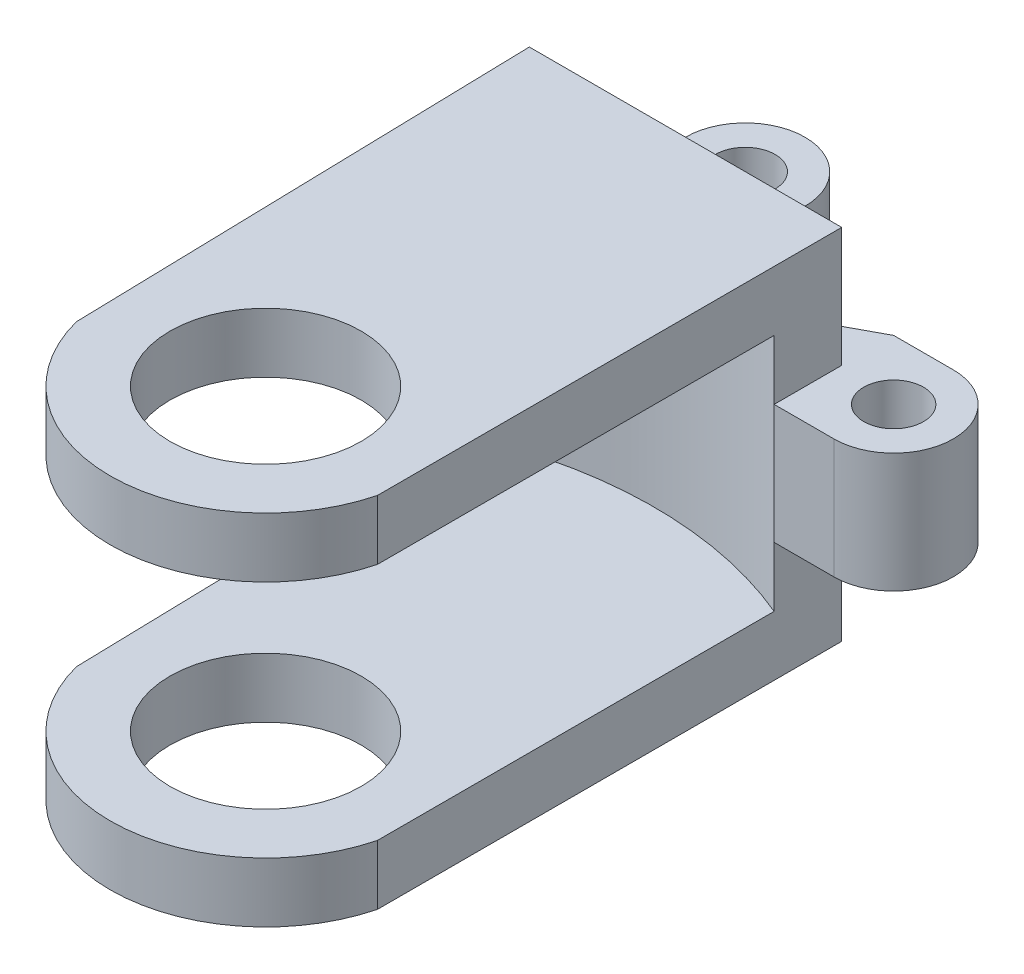
ISO-10303-21;
HEADER;
FILE_DESCRIPTION(('STEP AP214'),'2;1');
FILE_NAME('part.step','',(''),(''),'','','');
FILE_SCHEMA(('AUTOMOTIVE_DESIGN { 1 0 10303 214 1 1 1 1 }'));
ENDSEC;
DATA;
#1=APPLICATION_CONTEXT('core data for automotive mechanical design processes');
#2=APPLICATION_PROTOCOL_DEFINITION('international standard','automotive_design',2000,#1);
#3=PRODUCT_CONTEXT('',#1,'mechanical');
#4=PRODUCT('Part','Part','',(#3));
#5=PRODUCT_RELATED_PRODUCT_CATEGORY('part','',(#4));
#6=PRODUCT_DEFINITION_FORMATION('','',#4);
#7=PRODUCT_DEFINITION_CONTEXT('part definition',#1,'design');
#8=PRODUCT_DEFINITION('design','',#6,#7);
#9=PRODUCT_DEFINITION_SHAPE('','',#8);
#10=(LENGTH_UNIT() NAMED_UNIT(*) SI_UNIT(.MILLI.,.METRE.));
#11=(NAMED_UNIT(*) PLANE_ANGLE_UNIT() SI_UNIT($,.RADIAN.));
#12=(NAMED_UNIT(*) SI_UNIT($,.STERADIAN.) SOLID_ANGLE_UNIT());
#13=UNCERTAINTY_MEASURE_WITH_UNIT(LENGTH_MEASURE(1.E-05),#10,'distance_accuracy_value','');
#14=(GEOMETRIC_REPRESENTATION_CONTEXT(3) GLOBAL_UNCERTAINTY_ASSIGNED_CONTEXT((#13)) GLOBAL_UNIT_ASSIGNED_CONTEXT((#10,
#11,#12)) REPRESENTATION_CONTEXT('',''));
#15=CARTESIAN_POINT('',(0.,0.,0.));
#16=DIRECTION('',(0.,0.,1.));
#17=DIRECTION('',(1.,0.,0.));
#18=AXIS2_PLACEMENT_3D('',#15,#16,#17);
#19=CARTESIAN_POINT('',(0.,38.1,-45.2340686819217));
#20=DIRECTION('',(0.,0.,-1.));
#21=DIRECTION('',(-1.,0.,0.));
#22=AXIS2_PLACEMENT_3D('',#19,#20,#21);
#23=PLANE('',#22);
#24=DIRECTION('',(-1.,0.,0.));
#25=VECTOR('',#24,1.);
#26=CARTESIAN_POINT('',(15.9911865919839,12.7,-45.2340686819217));
#27=LINE('',#26,#25);
#28=CARTESIAN_POINT('',(15.9911865919839,12.7,-45.2340686819217));
#29=VERTEX_POINT('',#28);
#30=CARTESIAN_POINT('',(5.7409034787379,12.7,-45.2340686819217));
#31=VERTEX_POINT('',#30);
#32=EDGE_CURVE('E93',#29,#31,#27,.T.);
#33=ORIENTED_EDGE('',*,*,#32,.F.);
#34=DIRECTION('',(0.,1.,0.));
#35=VECTOR('',#34,1.);
#36=CARTESIAN_POINT('',(15.9911865919839,-50.229493101425,-45.2340686819217));
#37=LINE('',#36,#35);
#38=CARTESIAN_POINT('',(15.9911865919839,0.,-45.2340686819217));
#39=VERTEX_POINT('',#38);
#40=EDGE_CURVE('E353',#39,#29,#37,.T.);
#41=ORIENTED_EDGE('',*,*,#40,.F.);
#42=DIRECTION('',(1.,0.,0.));
#43=VECTOR('',#42,1.);
#44=CARTESIAN_POINT('',(0.,0.,-45.2340686819217));
#45=LINE('',#44,#43);
#46=CARTESIAN_POINT('',(-17.2093796345081,0.,-45.2340686819217));
#47=VERTEX_POINT('',#46);
#48=EDGE_CURVE('E408',#47,#39,#45,.T.);
#49=ORIENTED_EDGE('',*,*,#48,.F.);
#50=DIRECTION('',(0.,1.,0.));
#51=VECTOR('',#50,1.);
#52=CARTESIAN_POINT('',(-17.2093796345081,-50.229493101425,-45.2340686819217));
#53=LINE('',#52,#51);
#54=CARTESIAN_POINT('',(-17.2093796345081,38.1,-45.2340686819217));
#55=VERTEX_POINT('',#54);
#56=EDGE_CURVE('E361',#47,#55,#53,.T.);
#57=ORIENTED_EDGE('',*,*,#56,.T.);
#58=DIRECTION('',(1.,0.,0.));
#59=VECTOR('',#58,1.);
#60=CARTESIAN_POINT('',(0.,38.1,-45.2340686819217));
#61=LINE('',#60,#59);
#62=CARTESIAN_POINT('',(15.9911865919839,38.1,-45.2340686819217));
#63=VERTEX_POINT('',#62);
#64=EDGE_CURVE('E398',#55,#63,#61,.T.);
#65=ORIENTED_EDGE('',*,*,#64,.T.);
#66=CARTESIAN_POINT('',(15.9911865919839,25.4,-45.2340686819217));
#67=VERTEX_POINT('',#66);
#68=EDGE_CURVE('E357',#67,#63,#37,.T.);
#69=ORIENTED_EDGE('',*,*,#68,.F.);
#70=DIRECTION('',(-1.,0.,0.));
#71=VECTOR('',#70,1.);
#72=CARTESIAN_POINT('',(15.9911865919839,25.4,-45.2340686819217));
#73=LINE('',#72,#71);
#74=CARTESIAN_POINT('',(5.7409034787379,25.4,-45.2340686819217));
#75=VERTEX_POINT('',#74);
#76=EDGE_CURVE('E309',#67,#75,#73,.T.);
#77=ORIENTED_EDGE('',*,*,#76,.T.);
#78=DIRECTION('',(0.,-1.,0.));
#79=VECTOR('',#78,1.);
#80=CARTESIAN_POINT('',(5.7409034787379,31.75,-45.2340686819217));
#81=LINE('',#80,#79);
#82=CARTESIAN_POINT('',(5.7409034787379,31.75,-45.2340686819217));
#83=VERTEX_POINT('',#82);
#84=EDGE_CURVE('E339',#83,#75,#81,.T.);
#85=ORIENTED_EDGE('',*,*,#84,.F.);
#86=DIRECTION('',(1.,0.,0.));
#87=VECTOR('',#86,1.);
#88=CARTESIAN_POINT('',(0.,31.75,-45.2340686819217));
#89=LINE('',#88,#87);
#90=CARTESIAN_POINT('',(-6.9590965212621,31.75,-45.2340686819217));
#91=VERTEX_POINT('',#90);
#92=EDGE_CURVE('E321',#91,#83,#89,.T.);
#93=ORIENTED_EDGE('',*,*,#92,.F.);
#94=DIRECTION('',(0.,-1.,0.));
#95=VECTOR('',#94,1.);
#96=CARTESIAN_POINT('',(-6.9590965212621,31.75,-45.2340686819217));
#97=LINE('',#96,#95);
#98=CARTESIAN_POINT('',(-6.9590965212621,25.4,-45.2340686819217));
#99=VERTEX_POINT('',#98);
#100=EDGE_CURVE('E342',#91,#99,#97,.T.);
#101=ORIENTED_EDGE('',*,*,#100,.T.);
#102=DIRECTION('',(1.,0.,0.));
#103=VECTOR('',#102,1.);
#104=CARTESIAN_POINT('',(0.,25.4,-45.2340686819217));
#105=LINE('',#104,#103);
#106=EDGE_CURVE('E333',#99,#75,#105,.T.);
#107=ORIENTED_EDGE('',*,*,#106,.T.);
#108=DIRECTION('',(0.,-1.,0.));
#109=VECTOR('',#108,1.);
#110=CARTESIAN_POINT('',(5.7409034787379,25.4,-45.2340686819217));
#111=LINE('',#110,#109);
#112=EDGE_CURVE('E293',#75,#31,#111,.T.);
#113=ORIENTED_EDGE('',*,*,#112,.T.);
#114=DIRECTION('',(1.,0.,0.));
#115=VECTOR('',#114,1.);
#116=CARTESIAN_POINT('',(0.,12.7,-45.2340686819217));
#117=LINE('',#116,#115);
#118=CARTESIAN_POINT('',(-6.9590965212621,12.7,-45.2340686819217));
#119=VERTEX_POINT('',#118);
#120=EDGE_CURVE('E277',#119,#31,#117,.T.);
#121=ORIENTED_EDGE('',*,*,#120,.F.);
#122=DIRECTION('',(0.,1.,0.));
#123=VECTOR('',#122,1.);
#124=CARTESIAN_POINT('',(-6.9590965212621,6.35,-45.2340686819217));
#125=LINE('',#124,#123);
#126=CARTESIAN_POINT('',(-6.9590965212621,6.35,-45.2340686819217));
#127=VERTEX_POINT('',#126);
#128=EDGE_CURVE('E282',#127,#119,#125,.T.);
#129=ORIENTED_EDGE('',*,*,#128,.F.);
#130=DIRECTION('',(1.,0.,0.));
#131=VECTOR('',#130,1.);
#132=CARTESIAN_POINT('',(0.,6.35,-45.2340686819217));
#133=LINE('',#132,#131);
#134=CARTESIAN_POINT('',(5.7409034787379,6.35,-45.2340686819217));
#135=VERTEX_POINT('',#134);
#136=EDGE_CURVE('E262',#127,#135,#133,.T.);
#137=ORIENTED_EDGE('',*,*,#136,.T.);
#138=DIRECTION('',(0.,1.,0.));
#139=VECTOR('',#138,1.);
#140=CARTESIAN_POINT('',(5.7409034787379,6.35,-45.2340686819217));
#141=LINE('',#140,#139);
#142=EDGE_CURVE('E285',#135,#31,#141,.T.);
#143=ORIENTED_EDGE('',*,*,#142,.T.);
#144=EDGE_LOOP('',(#33,#41,#49,#57,#65,#69,#77,#85,#93,#101,#107,#113,#121,#129,#137,#143));
#145=FACE_BOUND('',#144,.T.);
#146=ADVANCED_FACE('F78',(#145),#23,.T.);
#147=CARTESIAN_POINT('',(15.9911865919839,-50.229493101425,0.));
#148=DIRECTION('',(1.,0.,0.));
#149=DIRECTION('',(0.,0.,-1.));
#150=AXIS2_PLACEMENT_3D('',#147,#148,#149);
#151=PLANE('',#150);
#152=DIRECTION('',(0.,0.,-1.));
#153=VECTOR('',#152,1.);
#154=CARTESIAN_POINT('',(15.9911865919839,12.7,0.));
#155=LINE('',#154,#153);
#156=CARTESIAN_POINT('',(15.9911865919839,12.7,-38.0513807421013));
#157=VERTEX_POINT('',#156);
#158=EDGE_CURVE('E245',#157,#29,#155,.T.);
#159=ORIENTED_EDGE('',*,*,#158,.F.);
#160=DIRECTION('',(0.,-1.,0.));
#161=VECTOR('',#160,1.);
#162=CARTESIAN_POINT('',(15.9911865919839,31.75,-38.0513807421013));
#163=LINE('',#162,#161);
#164=CARTESIAN_POINT('',(15.9911865919839,6.35,-38.0513807421013));
#165=VERTEX_POINT('',#164);
#166=EDGE_CURVE('E370',#165,#157,#163,.F.);
#167=ORIENTED_EDGE('',*,*,#166,.F.);
#168=DIRECTION('',(0.,0.,-1.));
#169=VECTOR('',#168,1.);
#170=CARTESIAN_POINT('',(15.9911865919839,6.35,0.));
#171=LINE('',#170,#169);
#172=CARTESIAN_POINT('',(15.9911865919839,6.35,4.10634282304279));
#173=VERTEX_POINT('',#172);
#174=EDGE_CURVE('E12',#173,#165,#171,.T.);
#175=ORIENTED_EDGE('',*,*,#174,.F.);
#176=DIRECTION('',(0.,-1.,0.));
#177=VECTOR('',#176,1.);
#178=CARTESIAN_POINT('',(15.9911865919839,38.1,4.10634282304279));
#179=LINE('',#178,#177);
#180=CARTESIAN_POINT('',(15.9911865919839,0.,4.10634282304279));
#181=VERTEX_POINT('',#180);
#182=EDGE_CURVE('E405',#173,#181,#179,.T.);
#183=ORIENTED_EDGE('',*,*,#182,.T.);
#184=DIRECTION('',(0.,0.,1.));
#185=VECTOR('',#184,1.);
#186=CARTESIAN_POINT('',(15.9911865919839,0.,0.));
#187=LINE('',#186,#185);
#188=EDGE_CURVE('E349',#39,#181,#187,.T.);
#189=ORIENTED_EDGE('',*,*,#188,.F.);
#190=ORIENTED_EDGE('',*,*,#40,.T.);
#191=EDGE_LOOP('',(#159,#167,#175,#183,#189,#190));
#192=FACE_BOUND('',#191,.T.);
#193=ADVANCED_FACE('F432',(#192),#151,.T.);
#194=CARTESIAN_POINT('',(0.,38.1,0.));
#195=DIRECTION('',(0.,1.,0.));
#196=DIRECTION('',(0.,0.,1.));
#197=AXIS2_PLACEMENT_3D('',#194,#195,#196);
#198=PLANE('',#197);
#199=CARTESIAN_POINT('',(0.,38.1,0.));
#200=DIRECTION('',(0.,1.,0.));
#201=DIRECTION('',(0.,0.,1.));
#202=AXIS2_PLACEMENT_3D('',#199,#200,#201);
#203=CIRCLE('',#202,10.16);
#204=CARTESIAN_POINT('',(0.,38.1,-10.16));
#205=VERTEX_POINT('',#204);
#206=EDGE_CURVE('E402',#205,#205,#203,.T.);
#207=ORIENTED_EDGE('',*,*,#206,.F.);
#208=EDGE_LOOP('',(#207));
#209=FACE_BOUND('',#208,.T.);
#210=CARTESIAN_POINT('',(0.,38.1,0.));
#211=DIRECTION('',(0.,1.,0.));
#212=DIRECTION('',(0.,0.,1.));
#213=AXIS2_PLACEMENT_3D('',#210,#211,#212);
#214=CIRCLE('',#213,16.51);
#215=CARTESIAN_POINT('',(-15.9911865919839,38.1,4.10634282304278));
#216=VERTEX_POINT('',#215);
#217=CARTESIAN_POINT('',(15.9911865919839,38.1,4.10634282304279));
#218=VERTEX_POINT('',#217);
#219=EDGE_CURVE('E395',#216,#218,#214,.T.);
#220=ORIENTED_EDGE('',*,*,#219,.T.);
#221=DIRECTION('',(0.,0.,-1.));
#222=VECTOR('',#221,1.);
#223=CARTESIAN_POINT('',(15.9911865919839,38.1,0.));
#224=LINE('',#223,#222);
#225=EDGE_CURVE('E354',#218,#63,#224,.T.);
#226=ORIENTED_EDGE('',*,*,#225,.T.);
#227=ORIENTED_EDGE('',*,*,#64,.F.);
#228=DIRECTION('',(-0.0246820382200632,0.,-0.999695352089477));
#229=VECTOR('',#228,1.);
#230=CARTESIAN_POINT('',(-16.082766746518,38.1,0.397076432027255));
#231=LINE('',#230,#229);
#232=EDGE_CURVE('E348',#216,#55,#231,.T.);
#233=ORIENTED_EDGE('',*,*,#232,.F.);
#234=EDGE_LOOP('',(#220,#226,#227,#233));
#235=FACE_BOUND('',#234,.T.);
#236=ADVANCED_FACE('F486',(#209,#235),#198,.T.);
#237=CARTESIAN_POINT('',(0.,0.,0.));
#238=DIRECTION('',(0.,1.,0.));
#239=DIRECTION('',(0.,0.,1.));
#240=AXIS2_PLACEMENT_3D('',#237,#238,#239);
#241=PLANE('',#240);
#242=CARTESIAN_POINT('',(0.,0.,0.));
#243=DIRECTION('',(0.,1.,0.));
#244=DIRECTION('',(0.,0.,1.));
#245=AXIS2_PLACEMENT_3D('',#242,#243,#244);
#246=CIRCLE('',#245,10.16);
#247=CARTESIAN_POINT('',(0.,0.,-10.16));
#248=VERTEX_POINT('',#247);
#249=EDGE_CURVE('E399',#248,#248,#246,.T.);
#250=ORIENTED_EDGE('',*,*,#249,.T.);
#251=EDGE_LOOP('',(#250));
#252=FACE_BOUND('',#251,.T.);
#253=ORIENTED_EDGE('',*,*,#188,.T.);
#254=CARTESIAN_POINT('',(0.,0.,0.));
#255=DIRECTION('',(0.,1.,0.));
#256=DIRECTION('',(0.,0.,1.));
#257=AXIS2_PLACEMENT_3D('',#254,#255,#256);
#258=CIRCLE('',#257,16.51);
#259=CARTESIAN_POINT('',(-15.9911865919839,0.,4.10634282304278));
#260=VERTEX_POINT('',#259);
#261=EDGE_CURVE('E387',#260,#181,#258,.T.);
#262=ORIENTED_EDGE('',*,*,#261,.F.);
#263=DIRECTION('',(0.0246820382200632,0.,0.999695352089477));
#264=VECTOR('',#263,1.);
#265=CARTESIAN_POINT('',(-16.082766746518,0.,0.397076432027255));
#266=LINE('',#265,#264);
#267=EDGE_CURVE('E358',#47,#260,#266,.T.);
#268=ORIENTED_EDGE('',*,*,#267,.F.);
#269=ORIENTED_EDGE('',*,*,#48,.T.);
#270=EDGE_LOOP('',(#253,#262,#268,#269));
#271=FACE_BOUND('',#270,.T.);
#272=ADVANCED_FACE('F494',(#252,#271),#241,.F.);
#273=CARTESIAN_POINT('',(0.,31.75,0.));
#274=DIRECTION('',(0.,-1.,0.));
#275=DIRECTION('',(0.,0.,-1.));
#276=AXIS2_PLACEMENT_3D('',#273,#274,#275);
#277=CYLINDRICAL_SURFACE('',#276,41.275);
#278=CARTESIAN_POINT('',(0.,6.35,0.));
#279=DIRECTION('',(0.,1.,0.));
#280=DIRECTION('',(0.,0.,1.));
#281=AXIS2_PLACEMENT_3D('',#278,#279,#280);
#282=CIRCLE('',#281,41.275);
#283=CARTESIAN_POINT('',(-17.0209480546768,6.35,-37.6020338854163));
#284=VERTEX_POINT('',#283);
#285=EDGE_CURVE('E390',#165,#284,#282,.T.);
#286=ORIENTED_EDGE('',*,*,#285,.F.);
#287=ORIENTED_EDGE('',*,*,#166,.T.);
#288=DIRECTION('',(0.,-1.,0.));
#289=VECTOR('',#288,1.);
#290=CARTESIAN_POINT('',(15.9911865919839,25.4,-38.0513807421013));
#291=LINE('',#290,#289);
#292=CARTESIAN_POINT('',(15.9911865919839,25.4,-38.0513807421013));
#293=VERTEX_POINT('',#292);
#294=EDGE_CURVE('E101',#293,#157,#291,.T.);
#295=ORIENTED_EDGE('',*,*,#294,.F.);
#296=CARTESIAN_POINT('',(15.9911865919839,31.75,-38.0513807421013));
#297=VERTEX_POINT('',#296);
#298=EDGE_CURVE('E369',#293,#297,#163,.F.);
#299=ORIENTED_EDGE('',*,*,#298,.T.);
#300=CARTESIAN_POINT('',(0.,31.75,0.));
#301=DIRECTION('',(0.,1.,0.));
#302=DIRECTION('',(0.,0.,1.));
#303=AXIS2_PLACEMENT_3D('',#300,#301,#302);
#304=CIRCLE('',#303,41.275);
#305=CARTESIAN_POINT('',(-17.0209480546768,31.75,-37.6020338854163));
#306=VERTEX_POINT('',#305);
#307=EDGE_CURVE('E380',#297,#306,#304,.T.);
#308=ORIENTED_EDGE('',*,*,#307,.T.);
#309=DIRECTION('',(0.,-1.,0.));
#310=VECTOR('',#309,1.);
#311=CARTESIAN_POINT('',(-17.0209480546768,31.75,-37.6020338854163));
#312=LINE('',#311,#310);
#313=EDGE_CURVE('E352',#284,#306,#312,.F.);
#314=ORIENTED_EDGE('',*,*,#313,.F.);
#315=EDGE_LOOP('',(#286,#287,#295,#299,#308,#314));
#316=FACE_BOUND('',#315,.T.);
#317=ADVANCED_FACE('F427',(#316),#277,.F.);
#318=CARTESIAN_POINT('',(0.,31.75,0.));
#319=DIRECTION('',(0.,1.,0.));
#320=DIRECTION('',(0.,0.,1.));
#321=AXIS2_PLACEMENT_3D('',#318,#319,#320);
#322=PLANE('',#321);
#323=CARTESIAN_POINT('',(0.,31.75,0.));
#324=DIRECTION('',(0.,1.,0.));
#325=DIRECTION('',(0.,0.,1.));
#326=AXIS2_PLACEMENT_3D('',#323,#324,#325);
#327=CIRCLE('',#326,10.16);
#328=CARTESIAN_POINT('',(0.,31.75,-10.16));
#329=VERTEX_POINT('',#328);
#330=EDGE_CURVE('E384',#329,#329,#327,.T.);
#331=ORIENTED_EDGE('',*,*,#330,.T.);
#332=EDGE_LOOP('',(#331));
#333=FACE_BOUND('',#332,.T.);
#334=DIRECTION('',(0.,0.,-1.));
#335=VECTOR('',#334,1.);
#336=CARTESIAN_POINT('',(15.9911865919839,31.75,0.));
#337=LINE('',#336,#335);
#338=CARTESIAN_POINT('',(15.9911865919839,31.75,4.10634282304279));
#339=VERTEX_POINT('',#338);
#340=EDGE_CURVE('E373',#339,#297,#337,.T.);
#341=ORIENTED_EDGE('',*,*,#340,.F.);
#342=CARTESIAN_POINT('',(0.,31.75,0.));
#343=DIRECTION('',(0.,1.,0.));
#344=DIRECTION('',(0.,0.,1.));
#345=AXIS2_PLACEMENT_3D('',#342,#343,#344);
#346=CIRCLE('',#345,16.51);
#347=CARTESIAN_POINT('',(-15.9911865919839,31.75,4.10634282304278));
#348=VERTEX_POINT('',#347);
#349=EDGE_CURVE('E377',#348,#339,#346,.T.);
#350=ORIENTED_EDGE('',*,*,#349,.F.);
#351=DIRECTION('',(-0.0246820382200632,0.,-0.999695352089477));
#352=VECTOR('',#351,1.);
#353=CARTESIAN_POINT('',(-16.082766746518,31.75,0.397076432027255));
#354=LINE('',#353,#352);
#355=EDGE_CURVE('E366',#348,#306,#354,.T.);
#356=ORIENTED_EDGE('',*,*,#355,.T.);
#357=ORIENTED_EDGE('',*,*,#307,.F.);
#358=EDGE_LOOP('',(#341,#350,#356,#357));
#359=FACE_BOUND('',#358,.T.);
#360=ADVANCED_FACE('F503',(#333,#359),#322,.F.);
#361=CARTESIAN_POINT('',(0.,6.35,0.));
#362=DIRECTION('',(0.,1.,0.));
#363=DIRECTION('',(0.,0.,1.));
#364=AXIS2_PLACEMENT_3D('',#361,#362,#363);
#365=PLANE('',#364);
#366=CARTESIAN_POINT('',(0.,6.35,0.));
#367=DIRECTION('',(0.,1.,0.));
#368=DIRECTION('',(0.,0.,1.));
#369=AXIS2_PLACEMENT_3D('',#366,#367,#368);
#370=CIRCLE('',#369,10.16);
#371=CARTESIAN_POINT('',(0.,6.34999999999999,-10.16));
#372=VERTEX_POINT('',#371);
#373=EDGE_CURVE('E381',#372,#372,#370,.T.);
#374=ORIENTED_EDGE('',*,*,#373,.F.);
#375=EDGE_LOOP('',(#374));
#376=FACE_BOUND('',#375,.T.);
#377=CARTESIAN_POINT('',(0.,6.35,0.));
#378=DIRECTION('',(0.,1.,0.));
#379=DIRECTION('',(0.,0.,1.));
#380=AXIS2_PLACEMENT_3D('',#377,#378,#379);
#381=CIRCLE('',#380,16.51);
#382=CARTESIAN_POINT('',(-15.9911865919839,6.35,4.10634282304279));
#383=VERTEX_POINT('',#382);
#384=EDGE_CURVE('E376',#383,#173,#381,.T.);
#385=ORIENTED_EDGE('',*,*,#384,.T.);
#386=ORIENTED_EDGE('',*,*,#174,.T.);
#387=ORIENTED_EDGE('',*,*,#285,.T.);
#388=DIRECTION('',(-0.0246820382200632,0.,-0.999695352089477));
#389=VECTOR('',#388,1.);
#390=CARTESIAN_POINT('',(-16.082766746518,6.35,0.397076432027255));
#391=LINE('',#390,#389);
#392=EDGE_CURVE('E86',#383,#284,#391,.T.);
#393=ORIENTED_EDGE('',*,*,#392,.F.);
#394=EDGE_LOOP('',(#385,#386,#387,#393));
#395=FACE_BOUND('',#394,.T.);
#396=ADVANCED_FACE('F429',(#376,#395),#365,.T.);
#397=CARTESIAN_POINT('',(0.,38.1,0.));
#398=DIRECTION('',(0.,-1.,0.));
#399=DIRECTION('',(0.,0.,-1.));
#400=AXIS2_PLACEMENT_3D('',#397,#398,#399);
#401=CYLINDRICAL_SURFACE('',#400,16.51);
#402=ORIENTED_EDGE('',*,*,#384,.F.);
#403=DIRECTION('',(0.,-1.,0.));
#404=VECTOR('',#403,1.);
#405=CARTESIAN_POINT('',(-15.9911865919839,38.1,4.10634282304279));
#406=LINE('',#405,#404);
#407=EDGE_CURVE('E415',#383,#260,#406,.T.);
#408=ORIENTED_EDGE('',*,*,#407,.T.);
#409=ORIENTED_EDGE('',*,*,#261,.T.);
#410=ORIENTED_EDGE('',*,*,#182,.F.);
#411=EDGE_LOOP('',(#402,#408,#409,#410));
#412=FACE_BOUND('',#411,.T.);
#413=ADVANCED_FACE('F506',(#412),#401,.T.);
#414=CARTESIAN_POINT('',(0.,38.1,0.));
#415=DIRECTION('',(0.,-1.,0.));
#416=DIRECTION('',(0.,0.,-1.));
#417=AXIS2_PLACEMENT_3D('',#414,#415,#416);
#418=CYLINDRICAL_SURFACE('',#417,10.16);
#419=CARTESIAN_POINT('',(0.,0.,-10.16));
#420=CARTESIAN_POINT('',(0.,0.0661458333333341,-10.16));
#421=CARTESIAN_POINT('',(0.,0.132291666666668,-10.16));
#422=CARTESIAN_POINT('',(0.,0.264583333333334,-10.16));
#423=CARTESIAN_POINT('',(0.,0.330729166666666,-10.16));
#424=CARTESIAN_POINT('',(0.,0.463020833333332,-10.16));
#425=CARTESIAN_POINT('',(0.,0.529166666666666,-10.16));
#426=CARTESIAN_POINT('',(0.,0.661458333333332,-10.16));
#427=CARTESIAN_POINT('',(0.,0.727604166666664,-10.16));
#428=CARTESIAN_POINT('',(0.,0.85989583333333,-10.16));
#429=CARTESIAN_POINT('',(0.,0.926041666666664,-10.16));
#430=CARTESIAN_POINT('',(0.,1.05833333333333,-10.16));
#431=CARTESIAN_POINT('',(0.,1.12447916666667,-10.16));
#432=CARTESIAN_POINT('',(0.,1.25677083333333,-10.16));
#433=CARTESIAN_POINT('',(0.,1.32291666666666,-10.16));
#434=CARTESIAN_POINT('',(0.,1.45520833333333,-10.16));
#435=CARTESIAN_POINT('',(0.,1.52135416666666,-10.16));
#436=CARTESIAN_POINT('',(0.,1.65364583333333,-10.16));
#437=CARTESIAN_POINT('',(0.,1.71979166666667,-10.16));
#438=CARTESIAN_POINT('',(0.,1.85208333333333,-10.16));
#439=CARTESIAN_POINT('',(0.,1.91822916666666,-10.16));
#440=CARTESIAN_POINT('',(0.,2.05052083333333,-10.16));
#441=CARTESIAN_POINT('',(0.,2.11666666666666,-10.16));
#442=CARTESIAN_POINT('',(0.,2.24895833333333,-10.16));
#443=CARTESIAN_POINT('',(0.,2.31510416666667,-10.16));
#444=CARTESIAN_POINT('',(0.,2.44739583333333,-10.16));
#445=CARTESIAN_POINT('',(0.,2.51354166666667,-10.16));
#446=CARTESIAN_POINT('',(0.,2.64583333333333,-10.16));
#447=CARTESIAN_POINT('',(0.,2.71197916666667,-10.16));
#448=CARTESIAN_POINT('',(0.,2.84427083333333,-10.16));
#449=CARTESIAN_POINT('',(0.,2.91041666666666,-10.16));
#450=CARTESIAN_POINT('',(0.,3.04270833333333,-10.16));
#451=CARTESIAN_POINT('',(0.,3.10885416666666,-10.16));
#452=CARTESIAN_POINT('',(0.,3.24114583333333,-10.16));
#453=CARTESIAN_POINT('',(0.,3.30729166666667,-10.16));
#454=CARTESIAN_POINT('',(0.,3.43958333333333,-10.16));
#455=CARTESIAN_POINT('',(0.,3.50572916666666,-10.16));
#456=CARTESIAN_POINT('',(0.,3.63802083333333,-10.16));
#457=CARTESIAN_POINT('',(0.,3.70416666666666,-10.16));
#458=CARTESIAN_POINT('',(0.,3.83645833333333,-10.16));
#459=CARTESIAN_POINT('',(0.,3.90260416666666,-10.16));
#460=CARTESIAN_POINT('',(0.,4.03489583333333,-10.16));
#461=CARTESIAN_POINT('',(0.,4.10104166666666,-10.16));
#462=CARTESIAN_POINT('',(0.,4.23333333333333,-10.16));
#463=CARTESIAN_POINT('',(0.,4.29947916666666,-10.16));
#464=CARTESIAN_POINT('',(0.,4.43177083333333,-10.16));
#465=CARTESIAN_POINT('',(0.,4.49791666666666,-10.16));
#466=CARTESIAN_POINT('',(0.,4.63020833333333,-10.16));
#467=CARTESIAN_POINT('',(0.,4.69635416666666,-10.16));
#468=CARTESIAN_POINT('',(0.,4.82864583333333,-10.16));
#469=CARTESIAN_POINT('',(0.,4.89479166666666,-10.16));
#470=CARTESIAN_POINT('',(0.,5.02708333333333,-10.16));
#471=CARTESIAN_POINT('',(0.,5.09322916666666,-10.16));
#472=CARTESIAN_POINT('',(0.,5.22552083333333,-10.16));
#473=CARTESIAN_POINT('',(0.,5.29166666666666,-10.16));
#474=CARTESIAN_POINT('',(0.,5.42395833333333,-10.16));
#475=CARTESIAN_POINT('',(0.,5.49010416666667,-10.16));
#476=CARTESIAN_POINT('',(0.,5.62239583333333,-10.16));
#477=CARTESIAN_POINT('',(0.,5.68854166666666,-10.16));
#478=CARTESIAN_POINT('',(0.,5.82083333333333,-10.16));
#479=CARTESIAN_POINT('',(0.,5.88697916666666,-10.16));
#480=CARTESIAN_POINT('',(0.,6.01927083333333,-10.16));
#481=CARTESIAN_POINT('',(0.,6.08541666666666,-10.16));
#482=CARTESIAN_POINT('',(0.,6.21770833333333,-10.16));
#483=CARTESIAN_POINT('',(0.,6.28385416666666,-10.16));
#484=CARTESIAN_POINT('',(0.,6.34999999999999,-10.16));
#485=B_SPLINE_CURVE_WITH_KNOTS('',3,(#419,#420,#421,#422,#423,#424,#425,#426,#427,#428,#429,
#430,#431,#432,#433,#434,#435,#436,#437,#438,#439,#440,#441,#442,#443,#444,#445,#446,#447,#448,
#449,#450,#451,#452,#453,#454,#455,#456,#457,#458,#459,#460,#461,#462,#463,#464,#465,#466,#467,
#468,#469,#470,#471,#472,#473,#474,#475,#476,#477,#478,#479,#480,#481,#482,#483,#484),
.UNSPECIFIED.,.F.,.F.,(4,2,2,2,2,2,2,2,2,2,2,2,2,2,2,2,2,2,2,2,2,2,2,2,2,2,2,2,2,2,2,2,4),(0.,
0.198437500000002,0.396874999999998,0.5953125,0.793749999999996,0.992187499999998,1.190625,
1.3890625,1.5875,1.7859375,1.984375,2.1828125,2.38125,2.5796875,2.778125,2.97656249999999,3.175,
3.3734375,3.571875,3.7703125,3.96874999999999,4.1671875,4.365625,4.56406249999999,4.7625,
4.9609375,5.15937499999999,5.3578125,5.55625,5.75468749999999,5.953125,6.15156249999999,
6.34999999999999),.UNSPECIFIED.);
#486=EDGE_CURVE('BSEAM493',#248,#372,#485,.T.);
#487=ORIENTED_EDGE('',*,*,#249,.F.);
#488=ORIENTED_EDGE('',*,*,#373,.T.);
#489=ORIENTED_EDGE('',*,*,#486,.T.);
#490=ORIENTED_EDGE('',*,*,#486,.F.);
#491=EDGE_LOOP('',(#487,#489,#488,#490));
#492=FACE_BOUND('',#491,.T.);
#493=ADVANCED_FACE('F493',(#492),#418,.F.);
#494=EDGE_CURVE('E416',#216,#348,#406,.T.);
#495=ORIENTED_EDGE('',*,*,#494,.T.);
#496=ORIENTED_EDGE('',*,*,#349,.T.);
#497=EDGE_CURVE('E413',#218,#339,#179,.T.);
#498=ORIENTED_EDGE('',*,*,#497,.F.);
#499=ORIENTED_EDGE('',*,*,#219,.F.);
#500=EDGE_LOOP('',(#495,#496,#498,#499));
#501=FACE_BOUND('',#500,.T.);
#502=ADVANCED_FACE('F80',(#501),#401,.T.);
#503=CARTESIAN_POINT('',(0.,31.75,-10.16));
#504=CARTESIAN_POINT('',(0.,31.8161458333333,-10.16));
#505=CARTESIAN_POINT('',(0.,31.8822916666667,-10.16));
#506=CARTESIAN_POINT('',(0.,32.0145833333333,-10.16));
#507=CARTESIAN_POINT('',(0.,32.0807291666667,-10.16));
#508=CARTESIAN_POINT('',(0.,32.2130208333333,-10.16));
#509=CARTESIAN_POINT('',(0.,32.2791666666667,-10.16));
#510=CARTESIAN_POINT('',(0.,32.4114583333333,-10.16));
#511=CARTESIAN_POINT('',(0.,32.4776041666667,-10.16));
#512=CARTESIAN_POINT('',(0.,32.6098958333333,-10.16));
#513=CARTESIAN_POINT('',(0.,32.6760416666667,-10.16));
#514=CARTESIAN_POINT('',(0.,32.8083333333333,-10.16));
#515=CARTESIAN_POINT('',(0.,32.8744791666667,-10.16));
#516=CARTESIAN_POINT('',(0.,33.0067708333333,-10.16));
#517=CARTESIAN_POINT('',(0.,33.0729166666667,-10.16));
#518=CARTESIAN_POINT('',(0.,33.2052083333333,-10.16));
#519=CARTESIAN_POINT('',(0.,33.2713541666667,-10.16));
#520=CARTESIAN_POINT('',(0.,33.4036458333333,-10.16));
#521=CARTESIAN_POINT('',(0.,33.4697916666667,-10.16));
#522=CARTESIAN_POINT('',(0.,33.6020833333333,-10.16));
#523=CARTESIAN_POINT('',(0.,33.6682291666667,-10.16));
#524=CARTESIAN_POINT('',(0.,33.8005208333333,-10.16));
#525=CARTESIAN_POINT('',(0.,33.8666666666667,-10.16));
#526=CARTESIAN_POINT('',(0.,33.9989583333333,-10.16));
#527=CARTESIAN_POINT('',(0.,34.0651041666667,-10.16));
#528=CARTESIAN_POINT('',(0.,34.1973958333333,-10.16));
#529=CARTESIAN_POINT('',(0.,34.2635416666667,-10.16));
#530=CARTESIAN_POINT('',(0.,34.3958333333333,-10.16));
#531=CARTESIAN_POINT('',(0.,34.4619791666667,-10.16));
#532=CARTESIAN_POINT('',(0.,34.5942708333333,-10.16));
#533=CARTESIAN_POINT('',(0.,34.6604166666667,-10.16));
#534=CARTESIAN_POINT('',(0.,34.7927083333333,-10.16));
#535=CARTESIAN_POINT('',(0.,34.8588541666667,-10.16));
#536=CARTESIAN_POINT('',(0.,34.9911458333333,-10.16));
#537=CARTESIAN_POINT('',(0.,35.0572916666667,-10.16));
#538=CARTESIAN_POINT('',(0.,35.1895833333333,-10.16));
#539=CARTESIAN_POINT('',(0.,35.2557291666667,-10.16));
#540=CARTESIAN_POINT('',(0.,35.3880208333333,-10.16));
#541=CARTESIAN_POINT('',(0.,35.4541666666667,-10.16));
#542=CARTESIAN_POINT('',(0.,35.5864583333333,-10.16));
#543=CARTESIAN_POINT('',(0.,35.6526041666667,-10.16));
#544=CARTESIAN_POINT('',(0.,35.7848958333333,-10.16));
#545=CARTESIAN_POINT('',(0.,35.8510416666667,-10.16));
#546=CARTESIAN_POINT('',(0.,35.9833333333333,-10.16));
#547=CARTESIAN_POINT('',(0.,36.0494791666667,-10.16));
#548=CARTESIAN_POINT('',(0.,36.1817708333333,-10.16));
#549=CARTESIAN_POINT('',(0.,36.2479166666667,-10.16));
#550=CARTESIAN_POINT('',(0.,36.3802083333333,-10.16));
#551=CARTESIAN_POINT('',(0.,36.4463541666667,-10.16));
#552=CARTESIAN_POINT('',(0.,36.5786458333333,-10.16));
#553=CARTESIAN_POINT('',(0.,36.6447916666667,-10.16));
#554=CARTESIAN_POINT('',(0.,36.7770833333333,-10.16));
#555=CARTESIAN_POINT('',(0.,36.8432291666667,-10.16));
#556=CARTESIAN_POINT('',(0.,36.9755208333333,-10.16));
#557=CARTESIAN_POINT('',(0.,37.0416666666667,-10.16));
#558=CARTESIAN_POINT('',(0.,37.1739583333333,-10.16));
#559=CARTESIAN_POINT('',(0.,37.2401041666667,-10.16));
#560=CARTESIAN_POINT('',(0.,37.3723958333333,-10.16));
#561=CARTESIAN_POINT('',(0.,37.4385416666667,-10.16));
#562=CARTESIAN_POINT('',(0.,37.5708333333333,-10.16));
#563=CARTESIAN_POINT('',(0.,37.6369791666667,-10.16));
#564=CARTESIAN_POINT('',(0.,37.7692708333333,-10.16));
#565=CARTESIAN_POINT('',(0.,37.8354166666667,-10.16));
#566=CARTESIAN_POINT('',(0.,37.9677083333333,-10.16));
#567=CARTESIAN_POINT('',(0.,38.0338541666667,-10.16));
#568=CARTESIAN_POINT('',(0.,38.1,-10.16));
#569=B_SPLINE_CURVE_WITH_KNOTS('',3,(#503,#504,#505,#506,#507,#508,#509,#510,#511,#512,#513,
#514,#515,#516,#517,#518,#519,#520,#521,#522,#523,#524,#525,#526,#527,#528,#529,#530,#531,#532,
#533,#534,#535,#536,#537,#538,#539,#540,#541,#542,#543,#544,#545,#546,#547,#548,#549,#550,#551,
#552,#553,#554,#555,#556,#557,#558,#559,#560,#561,#562,#563,#564,#565,#566,#567,#568),
.UNSPECIFIED.,.F.,.F.,(4,2,2,2,2,2,2,2,2,2,2,2,2,2,2,2,2,2,2,2,2,2,2,2,2,2,2,2,2,2,2,2,4),(0.,
0.198437500000002,0.396875000000005,0.5953125,0.793750000000003,0.992187500000005,1.190625,
1.3890625,1.58750000000001,1.7859375,1.984375,2.18281250000001,2.38125,2.5796875,
2.77812500000001,2.9765625,3.175,3.37343750000001,3.571875,3.7703125,3.96875000000001,4.1671875,
4.365625,4.56406250000001,4.7625,4.96093750000001,5.15937500000001,5.3578125,5.55625000000001,
5.75468750000001,5.953125,6.15156250000001,6.35000000000001),.UNSPECIFIED.);
#570=EDGE_CURVE('BSEAM489',#329,#205,#569,.T.);
#571=ORIENTED_EDGE('',*,*,#330,.F.);
#572=ORIENTED_EDGE('',*,*,#206,.T.);
#573=ORIENTED_EDGE('',*,*,#570,.T.);
#574=ORIENTED_EDGE('',*,*,#570,.F.);
#575=EDGE_LOOP('',(#571,#573,#572,#574));
#576=FACE_BOUND('',#575,.T.);
#577=ADVANCED_FACE('F489',(#576),#418,.F.);
#578=CARTESIAN_POINT('',(-16.082766746518,-50.229493101425,0.397076432027255));
#579=DIRECTION('',(0.999695352089477,0.,-0.0246820382200632));
#580=DIRECTION('',(-0.0246820382200632,0.,-0.999695352089477));
#581=AXIS2_PLACEMENT_3D('',#578,#579,#580);
#582=PLANE('',#581);
#583=ORIENTED_EDGE('',*,*,#494,.F.);
#584=ORIENTED_EDGE('',*,*,#232,.T.);
#585=ORIENTED_EDGE('',*,*,#56,.F.);
#586=ORIENTED_EDGE('',*,*,#267,.T.);
#587=ORIENTED_EDGE('',*,*,#407,.F.);
#588=ORIENTED_EDGE('',*,*,#392,.T.);
#589=ORIENTED_EDGE('',*,*,#313,.T.);
#590=ORIENTED_EDGE('',*,*,#355,.F.);
#591=EDGE_LOOP('',(#583,#584,#585,#586,#587,#588,#589,#590));
#592=FACE_BOUND('',#591,.T.);
#593=ADVANCED_FACE('F421',(#592),#582,.F.);
#594=DIRECTION('',(0.,0.,-1.));
#595=VECTOR('',#594,1.);
#596=CARTESIAN_POINT('',(15.9911865919839,25.4,0.));
#597=LINE('',#596,#595);
#598=EDGE_CURVE('E298',#293,#67,#597,.T.);
#599=ORIENTED_EDGE('',*,*,#598,.T.);
#600=ORIENTED_EDGE('',*,*,#68,.T.);
#601=ORIENTED_EDGE('',*,*,#225,.F.);
#602=ORIENTED_EDGE('',*,*,#497,.T.);
#603=ORIENTED_EDGE('',*,*,#340,.T.);
#604=ORIENTED_EDGE('',*,*,#298,.F.);
#605=EDGE_LOOP('',(#599,#600,#601,#602,#603,#604));
#606=FACE_BOUND('',#605,.T.);
#607=ADVANCED_FACE('F435',(#606),#151,.T.);
#608=CARTESIAN_POINT('',(-0.609096521262099,31.75,-51.5840686819217));
#609=DIRECTION('',(0.,-1.,0.));
#610=DIRECTION('',(0.,0.,-1.));
#611=AXIS2_PLACEMENT_3D('',#608,#609,#610);
#612=CYLINDRICAL_SURFACE('',#611,6.35);
#613=CARTESIAN_POINT('',(-0.609096521262099,25.4,-51.5840686819217));
#614=DIRECTION('',(0.,1.,0.));
#615=DIRECTION('',(0.,0.,1.));
#616=AXIS2_PLACEMENT_3D('',#613,#614,#615);
#617=CIRCLE('',#616,6.35);
#618=CARTESIAN_POINT('',(5.7409034787379,25.4,-51.5840686819217));
#619=VERTEX_POINT('',#618);
#620=CARTESIAN_POINT('',(-6.9590965212621,25.4,-51.5840686819217));
#621=VERTEX_POINT('',#620);
#622=EDGE_CURVE('E328',#619,#621,#617,.T.);
#623=ORIENTED_EDGE('',*,*,#622,.T.);
#624=DIRECTION('',(0.,-1.,0.));
#625=VECTOR('',#624,1.);
#626=CARTESIAN_POINT('',(-6.9590965212621,31.75,-51.5840686819217));
#627=LINE('',#626,#625);
#628=CARTESIAN_POINT('',(-6.9590965212621,31.75,-51.5840686819217));
#629=VERTEX_POINT('',#628);
#630=EDGE_CURVE('E345',#629,#621,#627,.T.);
#631=ORIENTED_EDGE('',*,*,#630,.F.);
#632=CARTESIAN_POINT('',(-0.609096521262099,31.75,-51.5840686819217));
#633=DIRECTION('',(0.,1.,0.));
#634=DIRECTION('',(0.,0.,1.));
#635=AXIS2_PLACEMENT_3D('',#632,#633,#634);
#636=CIRCLE('',#635,6.35);
#637=CARTESIAN_POINT('',(5.7409034787379,31.75,-51.5840686819217));
#638=VERTEX_POINT('',#637);
#639=EDGE_CURVE('E315',#638,#629,#636,.T.);
#640=ORIENTED_EDGE('',*,*,#639,.F.);
#641=DIRECTION('',(0.,-1.,0.));
#642=VECTOR('',#641,1.);
#643=CARTESIAN_POINT('',(5.7409034787379,31.75,-51.5840686819217));
#644=LINE('',#643,#642);
#645=EDGE_CURVE('E325',#638,#619,#644,.T.);
#646=ORIENTED_EDGE('',*,*,#645,.T.);
#647=EDGE_LOOP('',(#623,#631,#640,#646));
#648=FACE_BOUND('',#647,.T.);
#649=ADVANCED_FACE('F514',(#648),#612,.T.);
#650=CARTESIAN_POINT('',(-6.9590965212621,31.75,0.));
#651=DIRECTION('',(1.,0.,0.));
#652=DIRECTION('',(0.,0.,-1.));
#653=AXIS2_PLACEMENT_3D('',#650,#651,#652);
#654=PLANE('',#653);
#655=DIRECTION('',(0.,0.,1.));
#656=VECTOR('',#655,1.);
#657=CARTESIAN_POINT('',(-6.9590965212621,25.4,0.));
#658=LINE('',#657,#656);
#659=EDGE_CURVE('E331',#621,#99,#658,.T.);
#660=ORIENTED_EDGE('',*,*,#659,.T.);
#661=ORIENTED_EDGE('',*,*,#100,.F.);
#662=DIRECTION('',(0.,0.,1.));
#663=VECTOR('',#662,1.);
#664=CARTESIAN_POINT('',(-6.9590965212621,31.75,0.));
#665=LINE('',#664,#663);
#666=EDGE_CURVE('E319',#629,#91,#665,.T.);
#667=ORIENTED_EDGE('',*,*,#666,.F.);
#668=ORIENTED_EDGE('',*,*,#630,.T.);
#669=EDGE_LOOP('',(#660,#661,#667,#668));
#670=FACE_BOUND('',#669,.T.);
#671=ADVANCED_FACE('F518',(#670),#654,.F.);
#672=CARTESIAN_POINT('',(-0.609096521262099,31.75,-51.5840686819217));
#673=DIRECTION('',(0.,-1.,0.));
#674=DIRECTION('',(0.,0.,-1.));
#675=AXIS2_PLACEMENT_3D('',#672,#673,#674);
#676=CYLINDRICAL_SURFACE('',#675,3.175);
#677=CARTESIAN_POINT('',(-0.609096521262099,31.75,-51.5840686819217));
#678=DIRECTION('',(0.,1.,0.));
#679=DIRECTION('',(0.,0.,1.));
#680=AXIS2_PLACEMENT_3D('',#677,#678,#679);
#681=CIRCLE('',#680,3.175);
#682=CARTESIAN_POINT('',(-0.609096521262099,31.75,-48.4090686819217));
#683=VERTEX_POINT('',#682);
#684=EDGE_CURVE('E312',#683,#683,#681,.T.);
#685=ORIENTED_EDGE('',*,*,#684,.T.);
#686=EDGE_LOOP('',(#685));
#687=FACE_BOUND('',#686,.T.);
#688=CARTESIAN_POINT('',(-0.609096521262099,25.4,-51.5840686819217));
#689=DIRECTION('',(0.,1.,0.));
#690=DIRECTION('',(0.,0.,1.));
#691=AXIS2_PLACEMENT_3D('',#688,#689,#690);
#692=CIRCLE('',#691,3.175);
#693=CARTESIAN_POINT('',(-0.609096521262099,25.4,-48.4090686819217));
#694=VERTEX_POINT('',#693);
#695=EDGE_CURVE('E306',#694,#694,#692,.T.);
#696=ORIENTED_EDGE('',*,*,#695,.F.);
#697=EDGE_LOOP('',(#696));
#698=FACE_BOUND('',#697,.T.);
#699=ADVANCED_FACE('F515',(#687,#698),#676,.F.);
#700=CARTESIAN_POINT('',(5.7409034787379,31.75,0.));
#701=DIRECTION('',(-1.,0.,0.));
#702=DIRECTION('',(0.,0.,1.));
#703=AXIS2_PLACEMENT_3D('',#700,#701,#702);
#704=PLANE('',#703);
#705=DIRECTION('',(0.,0.,-1.));
#706=VECTOR('',#705,1.);
#707=CARTESIAN_POINT('',(5.7409034787379,25.4,0.));
#708=LINE('',#707,#706);
#709=EDGE_CURVE('E316',#75,#619,#708,.T.);
#710=ORIENTED_EDGE('',*,*,#709,.T.);
#711=ORIENTED_EDGE('',*,*,#645,.F.);
#712=DIRECTION('',(0.,0.,-1.));
#713=VECTOR('',#712,1.);
#714=CARTESIAN_POINT('',(5.7409034787379,31.75,0.));
#715=LINE('',#714,#713);
#716=EDGE_CURVE('E323',#83,#638,#715,.T.);
#717=ORIENTED_EDGE('',*,*,#716,.F.);
#718=ORIENTED_EDGE('',*,*,#84,.T.);
#719=EDGE_LOOP('',(#710,#711,#717,#718));
#720=FACE_BOUND('',#719,.T.);
#721=ADVANCED_FACE('F454',(#720),#704,.F.);
#722=CARTESIAN_POINT('',(0.,31.75,0.));
#723=DIRECTION('',(0.,1.,0.));
#724=DIRECTION('',(0.,0.,1.));
#725=AXIS2_PLACEMENT_3D('',#722,#723,#724);
#726=PLANE('',#725);
#727=ORIENTED_EDGE('',*,*,#684,.F.);
#728=EDGE_LOOP('',(#727));
#729=FACE_BOUND('',#728,.T.);
#730=ORIENTED_EDGE('',*,*,#639,.T.);
#731=ORIENTED_EDGE('',*,*,#666,.T.);
#732=ORIENTED_EDGE('',*,*,#92,.T.);
#733=ORIENTED_EDGE('',*,*,#716,.T.);
#734=EDGE_LOOP('',(#730,#731,#732,#733));
#735=FACE_BOUND('',#734,.T.);
#736=ADVANCED_FACE('F478',(#729,#735),#726,.T.);
#737=CARTESIAN_POINT('',(0.,25.4,0.));
#738=DIRECTION('',(0.,1.,0.));
#739=DIRECTION('',(0.,0.,1.));
#740=AXIS2_PLACEMENT_3D('',#737,#738,#739);
#741=PLANE('',#740);
#742=ORIENTED_EDGE('',*,*,#695,.T.);
#743=EDGE_LOOP('',(#742));
#744=FACE_BOUND('',#743,.T.);
#745=ORIENTED_EDGE('',*,*,#622,.F.);
#746=ORIENTED_EDGE('',*,*,#709,.F.);
#747=ORIENTED_EDGE('',*,*,#106,.F.);
#748=ORIENTED_EDGE('',*,*,#659,.F.);
#749=EDGE_LOOP('',(#745,#746,#747,#748));
#750=FACE_BOUND('',#749,.T.);
#751=ADVANCED_FACE('F450',(#744,#750),#741,.F.);
#752=CARTESIAN_POINT('',(22.3411865919839,25.4,-44.4013807421013));
#753=DIRECTION('',(0.,-1.,0.));
#754=DIRECTION('',(0.,0.,-1.));
#755=AXIS2_PLACEMENT_3D('',#752,#753,#754);
#756=CYLINDRICAL_SURFACE('',#755,3.175);
#757=CARTESIAN_POINT('',(22.3411865919839,25.4,-44.4013807421013));
#758=DIRECTION('',(0.,1.,0.));
#759=DIRECTION('',(0.,0.,1.));
#760=AXIS2_PLACEMENT_3D('',#757,#758,#759);
#761=CIRCLE('',#760,3.175);
#762=CARTESIAN_POINT('',(22.3411865919839,25.4,-41.2263807421013));
#763=VERTEX_POINT('',#762);
#764=EDGE_CURVE('E290',#763,#763,#761,.T.);
#765=ORIENTED_EDGE('',*,*,#764,.T.);
#766=EDGE_LOOP('',(#765));
#767=FACE_BOUND('',#766,.T.);
#768=CARTESIAN_POINT('',(22.3411865919839,12.7,-44.4013807421013));
#769=DIRECTION('',(0.,1.,0.));
#770=DIRECTION('',(0.,0.,1.));
#771=AXIS2_PLACEMENT_3D('',#768,#769,#770);
#772=CIRCLE('',#771,3.175);
#773=CARTESIAN_POINT('',(22.3411865919839,12.7,-41.2263807421013));
#774=VERTEX_POINT('',#773);
#775=EDGE_CURVE('E242',#774,#774,#772,.T.);
#776=ORIENTED_EDGE('',*,*,#775,.F.);
#777=EDGE_LOOP('',(#776));
#778=FACE_BOUND('',#777,.T.);
#779=ADVANCED_FACE('F469',(#767,#778),#756,.F.);
#780=CARTESIAN_POINT('',(22.3411865919839,25.4,-44.4013807421013));
#781=DIRECTION('',(0.,-1.,0.));
#782=DIRECTION('',(0.,0.,-1.));
#783=AXIS2_PLACEMENT_3D('',#780,#781,#782);
#784=CYLINDRICAL_SURFACE('',#783,6.35);
#785=DIRECTION('',(0.,-1.,0.));
#786=VECTOR('',#785,1.);
#787=CARTESIAN_POINT('',(22.3411865919839,25.4,-38.0513807421013));
#788=LINE('',#787,#786);
#789=CARTESIAN_POINT('',(22.3411865919839,25.4,-38.0513807421013));
#790=VERTEX_POINT('',#789);
#791=CARTESIAN_POINT('',(22.3411865919839,12.7,-38.0513807421013));
#792=VERTEX_POINT('',#791);
#793=EDGE_CURVE('E225',#790,#792,#788,.T.);
#794=ORIENTED_EDGE('',*,*,#793,.T.);
#795=CARTESIAN_POINT('',(22.3411865919839,12.7,-44.4013807421013));
#796=DIRECTION('',(0.,1.,0.));
#797=DIRECTION('',(0.,0.,1.));
#798=AXIS2_PLACEMENT_3D('',#795,#796,#797);
#799=CIRCLE('',#798,6.35);
#800=CARTESIAN_POINT('',(22.3411865919839,12.7,-50.7513807421013));
#801=VERTEX_POINT('',#800);
#802=EDGE_CURVE('E229',#792,#801,#799,.T.);
#803=ORIENTED_EDGE('',*,*,#802,.T.);
#804=DIRECTION('',(0.,-1.,0.));
#805=VECTOR('',#804,1.);
#806=CARTESIAN_POINT('',(22.3411865919839,25.4,-50.7513807421013));
#807=LINE('',#806,#805);
#808=CARTESIAN_POINT('',(22.3411865919839,25.4,-50.7513807421013));
#809=VERTEX_POINT('',#808);
#810=EDGE_CURVE('E304',#809,#801,#807,.T.);
#811=ORIENTED_EDGE('',*,*,#810,.F.);
#812=CARTESIAN_POINT('',(22.3411865919839,25.4,-44.4013807421013));
#813=DIRECTION('',(0.,1.,0.));
#814=DIRECTION('',(0.,0.,1.));
#815=AXIS2_PLACEMENT_3D('',#812,#813,#814);
#816=CIRCLE('',#815,6.35);
#817=EDGE_CURVE('E230',#790,#809,#816,.T.);
#818=ORIENTED_EDGE('',*,*,#817,.F.);
#819=EDGE_LOOP('',(#794,#803,#811,#818));
#820=FACE_BOUND('',#819,.T.);
#821=ADVANCED_FACE('F227',(#820),#784,.T.);
#822=CARTESIAN_POINT('',(0.,25.4,-38.0513807421013));
#823=DIRECTION('',(0.,0.,-1.));
#824=DIRECTION('',(-1.,0.,0.));
#825=AXIS2_PLACEMENT_3D('',#822,#823,#824);
#826=PLANE('',#825);
#827=ORIENTED_EDGE('',*,*,#294,.T.);
#828=DIRECTION('',(1.,0.,0.));
#829=VECTOR('',#828,1.);
#830=CARTESIAN_POINT('',(0.,12.7,-38.0513807421013));
#831=LINE('',#830,#829);
#832=EDGE_CURVE('E238',#157,#792,#831,.T.);
#833=ORIENTED_EDGE('',*,*,#832,.T.);
#834=ORIENTED_EDGE('',*,*,#793,.F.);
#835=DIRECTION('',(1.,0.,0.));
#836=VECTOR('',#835,1.);
#837=CARTESIAN_POINT('',(0.,25.4,-38.0513807421013));
#838=LINE('',#837,#836);
#839=EDGE_CURVE('E231',#293,#790,#838,.T.);
#840=ORIENTED_EDGE('',*,*,#839,.F.);
#841=EDGE_LOOP('',(#827,#833,#834,#840));
#842=FACE_BOUND('',#841,.T.);
#843=ADVANCED_FACE('F244',(#842),#826,.F.);
#844=CARTESIAN_POINT('',(0.,25.4,0.));
#845=DIRECTION('',(0.,1.,0.));
#846=DIRECTION('',(0.,0.,1.));
#847=AXIS2_PLACEMENT_3D('',#844,#845,#846);
#848=PLANE('',#847);
#849=ORIENTED_EDGE('',*,*,#764,.F.);
#850=EDGE_LOOP('',(#849));
#851=FACE_BOUND('',#850,.T.);
#852=ORIENTED_EDGE('',*,*,#817,.T.);
#853=DIRECTION('',(1.,0.,0.));
#854=VECTOR('',#853,1.);
#855=CARTESIAN_POINT('',(0.,25.4,-50.7513807421013));
#856=LINE('',#855,#854);
#857=CARTESIAN_POINT('',(15.9911865919839,25.4,-50.7513807421013));
#858=VERTEX_POINT('',#857);
#859=EDGE_CURVE('E295',#858,#809,#856,.T.);
#860=ORIENTED_EDGE('',*,*,#859,.F.);
#861=DIRECTION('',(0.880545359096887,0.,-0.473961887257756));
#862=VECTOR('',#861,1.);
#863=CARTESIAN_POINT('',(5.7409034787379,25.4,-45.2340686819217));
#864=LINE('',#863,#862);
#865=EDGE_CURVE('E289',#75,#858,#864,.T.);
#866=ORIENTED_EDGE('',*,*,#865,.F.);
#867=ORIENTED_EDGE('',*,*,#76,.F.);
#868=ORIENTED_EDGE('',*,*,#598,.F.);
#869=ORIENTED_EDGE('',*,*,#839,.T.);
#870=EDGE_LOOP('',(#852,#860,#866,#867,#868,#869));
#871=FACE_BOUND('',#870,.T.);
#872=ADVANCED_FACE('F441',(#851,#871),#848,.T.);
#873=CARTESIAN_POINT('',(0.,25.4,-50.7513807421013));
#874=DIRECTION('',(0.,0.,-1.));
#875=DIRECTION('',(-1.,0.,0.));
#876=AXIS2_PLACEMENT_3D('',#873,#874,#875);
#877=PLANE('',#876);
#878=ORIENTED_EDGE('',*,*,#810,.T.);
#879=DIRECTION('',(1.,0.,0.));
#880=VECTOR('',#879,1.);
#881=CARTESIAN_POINT('',(0.,12.7,-50.7513807421013));
#882=LINE('',#881,#880);
#883=CARTESIAN_POINT('',(15.9911865919839,12.7,-50.7513807421013));
#884=VERTEX_POINT('',#883);
#885=EDGE_CURVE('E241',#884,#801,#882,.T.);
#886=ORIENTED_EDGE('',*,*,#885,.F.);
#887=DIRECTION('',(0.,-1.,0.));
#888=VECTOR('',#887,1.);
#889=CARTESIAN_POINT('',(15.9911865919839,25.4,-50.7513807421013));
#890=LINE('',#889,#888);
#891=EDGE_CURVE('E302',#858,#884,#890,.T.);
#892=ORIENTED_EDGE('',*,*,#891,.F.);
#893=ORIENTED_EDGE('',*,*,#859,.T.);
#894=EDGE_LOOP('',(#878,#886,#892,#893));
#895=FACE_BOUND('',#894,.T.);
#896=ADVANCED_FACE('F532',(#895),#877,.T.);
#897=CARTESIAN_POINT('',(5.7409034787379,25.4,-45.2340686819217));
#898=DIRECTION('',(-0.473961887257757,0.,-0.880545359096887));
#899=DIRECTION('',(-0.880545359096887,0.,0.473961887257757));
#900=AXIS2_PLACEMENT_3D('',#897,#898,#899);
#901=PLANE('',#900);
#902=ORIENTED_EDGE('',*,*,#891,.T.);
#903=DIRECTION('',(0.880545359096887,0.,-0.473961887257756));
#904=VECTOR('',#903,1.);
#905=CARTESIAN_POINT('',(5.7409034787379,12.7,-45.2340686819217));
#906=LINE('',#905,#904);
#907=EDGE_CURVE('E462',#31,#884,#906,.T.);
#908=ORIENTED_EDGE('',*,*,#907,.F.);
#909=ORIENTED_EDGE('',*,*,#112,.F.);
#910=ORIENTED_EDGE('',*,*,#865,.T.);
#911=EDGE_LOOP('',(#902,#908,#909,#910));
#912=FACE_BOUND('',#911,.T.);
#913=ADVANCED_FACE('F461',(#912),#901,.T.);
#914=CARTESIAN_POINT('',(-0.609096521262099,6.35,-51.5840686819217));
#915=DIRECTION('',(0.,1.,0.));
#916=DIRECTION('',(0.,0.,1.));
#917=AXIS2_PLACEMENT_3D('',#914,#915,#916);
#918=CYLINDRICAL_SURFACE('',#917,6.35);
#919=CARTESIAN_POINT('',(-0.609096521262099,12.7,-51.5840686819217));
#920=DIRECTION('',(0.,1.,0.));
#921=DIRECTION('',(0.,0.,1.));
#922=AXIS2_PLACEMENT_3D('',#919,#920,#921);
#923=CIRCLE('',#922,6.35);
#924=CARTESIAN_POINT('',(5.7409034787379,12.7,-51.5840686819217));
#925=VERTEX_POINT('',#924);
#926=CARTESIAN_POINT('',(-6.9590965212621,12.7,-51.5840686819217));
#927=VERTEX_POINT('',#926);
#928=EDGE_CURVE('E271',#925,#927,#923,.T.);
#929=ORIENTED_EDGE('',*,*,#928,.F.);
#930=DIRECTION('',(0.,1.,0.));
#931=VECTOR('',#930,1.);
#932=CARTESIAN_POINT('',(5.7409034787379,6.35,-51.5840686819217));
#933=LINE('',#932,#931);
#934=CARTESIAN_POINT('',(5.7409034787379,6.35,-51.5840686819217));
#935=VERTEX_POINT('',#934);
#936=EDGE_CURVE('E287',#935,#925,#933,.T.);
#937=ORIENTED_EDGE('',*,*,#936,.F.);
#938=CARTESIAN_POINT('',(-0.609096521262099,6.35,-51.5840686819217));
#939=DIRECTION('',(0.,1.,0.));
#940=DIRECTION('',(0.,0.,1.));
#941=AXIS2_PLACEMENT_3D('',#938,#939,#940);
#942=CIRCLE('',#941,6.35);
#943=CARTESIAN_POINT('',(-6.9590965212621,6.35,-51.5840686819217));
#944=VERTEX_POINT('',#943);
#945=EDGE_CURVE('E255',#935,#944,#942,.T.);
#946=ORIENTED_EDGE('',*,*,#945,.T.);
#947=DIRECTION('',(0.,1.,0.));
#948=VECTOR('',#947,1.);
#949=CARTESIAN_POINT('',(-6.9590965212621,6.35,-51.5840686819217));
#950=LINE('',#949,#948);
#951=EDGE_CURVE('E268',#944,#927,#950,.T.);
#952=ORIENTED_EDGE('',*,*,#951,.T.);
#953=EDGE_LOOP('',(#929,#937,#946,#952));
#954=FACE_BOUND('',#953,.T.);
#955=ADVANCED_FACE('F531',(#954),#918,.T.);
#956=CARTESIAN_POINT('',(5.7409034787379,6.35,0.));
#957=DIRECTION('',(1.,0.,0.));
#958=DIRECTION('',(0.,0.,-1.));
#959=AXIS2_PLACEMENT_3D('',#956,#957,#958);
#960=PLANE('',#959);
#961=DIRECTION('',(0.,0.,-1.));
#962=VECTOR('',#961,1.);
#963=CARTESIAN_POINT('',(5.7409034787379,12.7,0.));
#964=LINE('',#963,#962);
#965=EDGE_CURVE('E274',#31,#925,#964,.T.);
#966=ORIENTED_EDGE('',*,*,#965,.F.);
#967=ORIENTED_EDGE('',*,*,#142,.F.);
#968=DIRECTION('',(0.,0.,-1.));
#969=VECTOR('',#968,1.);
#970=CARTESIAN_POINT('',(5.7409034787379,6.35,0.));
#971=LINE('',#970,#969);
#972=EDGE_CURVE('E259',#135,#935,#971,.T.);
#973=ORIENTED_EDGE('',*,*,#972,.T.);
#974=ORIENTED_EDGE('',*,*,#936,.T.);
#975=EDGE_LOOP('',(#966,#967,#973,#974));
#976=FACE_BOUND('',#975,.T.);
#977=ADVANCED_FACE('F537',(#976),#960,.T.);
#978=CARTESIAN_POINT('',(-0.609096521262099,6.35,-51.5840686819217));
#979=DIRECTION('',(0.,1.,0.));
#980=DIRECTION('',(0.,0.,1.));
#981=AXIS2_PLACEMENT_3D('',#978,#979,#980);
#982=CYLINDRICAL_SURFACE('',#981,3.175);
#983=CARTESIAN_POINT('',(-0.609096521262099,6.35,-51.5840686819217));
#984=DIRECTION('',(0.,1.,0.));
#985=DIRECTION('',(0.,0.,1.));
#986=AXIS2_PLACEMENT_3D('',#983,#984,#985);
#987=CIRCLE('',#986,3.175);
#988=CARTESIAN_POINT('',(-0.609096521262099,6.35,-48.4090686819217));
#989=VERTEX_POINT('',#988);
#990=EDGE_CURVE('E252',#989,#989,#987,.T.);
#991=ORIENTED_EDGE('',*,*,#990,.F.);
#992=EDGE_LOOP('',(#991));
#993=FACE_BOUND('',#992,.T.);
#994=CARTESIAN_POINT('',(-0.609096521262099,12.7,-51.5840686819217));
#995=DIRECTION('',(0.,1.,0.));
#996=DIRECTION('',(0.,0.,1.));
#997=AXIS2_PLACEMENT_3D('',#994,#995,#996);
#998=CIRCLE('',#997,3.175);
#999=CARTESIAN_POINT('',(-0.609096521262099,12.7,-48.4090686819217));
#1000=VERTEX_POINT('',#999);
#1001=EDGE_CURVE('E251',#1000,#1000,#998,.T.);
#1002=ORIENTED_EDGE('',*,*,#1001,.T.);
#1003=EDGE_LOOP('',(#1002));
#1004=FACE_BOUND('',#1003,.T.);
#1005=ADVANCED_FACE('F550',(#993,#1004),#982,.F.);
#1006=CARTESIAN_POINT('',(-6.9590965212621,6.35,0.));
#1007=DIRECTION('',(-1.,0.,0.));
#1008=DIRECTION('',(0.,0.,1.));
#1009=AXIS2_PLACEMENT_3D('',#1006,#1007,#1008);
#1010=PLANE('',#1009);
#1011=DIRECTION('',(0.,0.,1.));
#1012=VECTOR('',#1011,1.);
#1013=CARTESIAN_POINT('',(-6.9590965212621,12.7,0.));
#1014=LINE('',#1013,#1012);
#1015=EDGE_CURVE('E256',#927,#119,#1014,.T.);
#1016=ORIENTED_EDGE('',*,*,#1015,.F.);
#1017=ORIENTED_EDGE('',*,*,#951,.F.);
#1018=DIRECTION('',(0.,0.,1.));
#1019=VECTOR('',#1018,1.);
#1020=CARTESIAN_POINT('',(-6.9590965212621,6.35,0.));
#1021=LINE('',#1020,#1019);
#1022=EDGE_CURVE('E265',#944,#127,#1021,.T.);
#1023=ORIENTED_EDGE('',*,*,#1022,.T.);
#1024=ORIENTED_EDGE('',*,*,#128,.T.);
#1025=EDGE_LOOP('',(#1016,#1017,#1023,#1024));
#1026=FACE_BOUND('',#1025,.T.);
#1027=ADVANCED_FACE('F552',(#1026),#1010,.T.);
#1028=CARTESIAN_POINT('',(0.,6.35,0.));
#1029=DIRECTION('',(0.,-1.,0.));
#1030=DIRECTION('',(0.,0.,1.));
#1031=AXIS2_PLACEMENT_3D('',#1028,#1029,#1030);
#1032=PLANE('',#1031);
#1033=ORIENTED_EDGE('',*,*,#990,.T.);
#1034=EDGE_LOOP('',(#1033));
#1035=FACE_BOUND('',#1034,.T.);
#1036=ORIENTED_EDGE('',*,*,#945,.F.);
#1037=ORIENTED_EDGE('',*,*,#972,.F.);
#1038=ORIENTED_EDGE('',*,*,#136,.F.);
#1039=ORIENTED_EDGE('',*,*,#1022,.F.);
#1040=EDGE_LOOP('',(#1036,#1037,#1038,#1039));
#1041=FACE_BOUND('',#1040,.T.);
#1042=ADVANCED_FACE('F560',(#1035,#1041),#1032,.T.);
#1043=CARTESIAN_POINT('',(0.,12.7,0.));
#1044=DIRECTION('',(0.,-1.,0.));
#1045=DIRECTION('',(0.,0.,1.));
#1046=AXIS2_PLACEMENT_3D('',#1043,#1044,#1045);
#1047=PLANE('',#1046);
#1048=ORIENTED_EDGE('',*,*,#1001,.F.);
#1049=EDGE_LOOP('',(#1048));
#1050=FACE_BOUND('',#1049,.T.);
#1051=ORIENTED_EDGE('',*,*,#928,.T.);
#1052=ORIENTED_EDGE('',*,*,#1015,.T.);
#1053=ORIENTED_EDGE('',*,*,#120,.T.);
#1054=ORIENTED_EDGE('',*,*,#965,.T.);
#1055=EDGE_LOOP('',(#1051,#1052,#1053,#1054));
#1056=FACE_BOUND('',#1055,.T.);
#1057=ADVANCED_FACE('F562',(#1050,#1056),#1047,.F.);
#1058=CARTESIAN_POINT('',(0.,12.7,0.));
#1059=DIRECTION('',(0.,-1.,0.));
#1060=DIRECTION('',(0.,0.,1.));
#1061=AXIS2_PLACEMENT_3D('',#1058,#1059,#1060);
#1062=PLANE('',#1061);
#1063=ORIENTED_EDGE('',*,*,#775,.T.);
#1064=EDGE_LOOP('',(#1063));
#1065=FACE_BOUND('',#1064,.T.);
#1066=ORIENTED_EDGE('',*,*,#802,.F.);
#1067=ORIENTED_EDGE('',*,*,#832,.F.);
#1068=ORIENTED_EDGE('',*,*,#158,.T.);
#1069=ORIENTED_EDGE('',*,*,#32,.T.);
#1070=ORIENTED_EDGE('',*,*,#907,.T.);
#1071=ORIENTED_EDGE('',*,*,#885,.T.);
#1072=EDGE_LOOP('',(#1066,#1067,#1068,#1069,#1070,#1071));
#1073=FACE_BOUND('',#1072,.T.);
#1074=ADVANCED_FACE('F236',(#1065,#1073),#1062,.T.);
#1075=CLOSED_SHELL('',(#146,#193,#236,#272,#317,#360,#396,#413,#493,#502,#577,#593,#607,#649,
#671,#699,#721,#736,#751,#779,#821,#843,#872,#896,#913,#955,#977,#1005,#1027,#1042,#1057,#1074));
#1076=MANIFOLD_SOLID_BREP('B2',#1075);
#1077=ADVANCED_BREP_SHAPE_REPRESENTATION('',(#18,#1076),#14);
#1078=SHAPE_DEFINITION_REPRESENTATION(#9,#1077);
ENDSEC;
END-ISO-10303-21;
